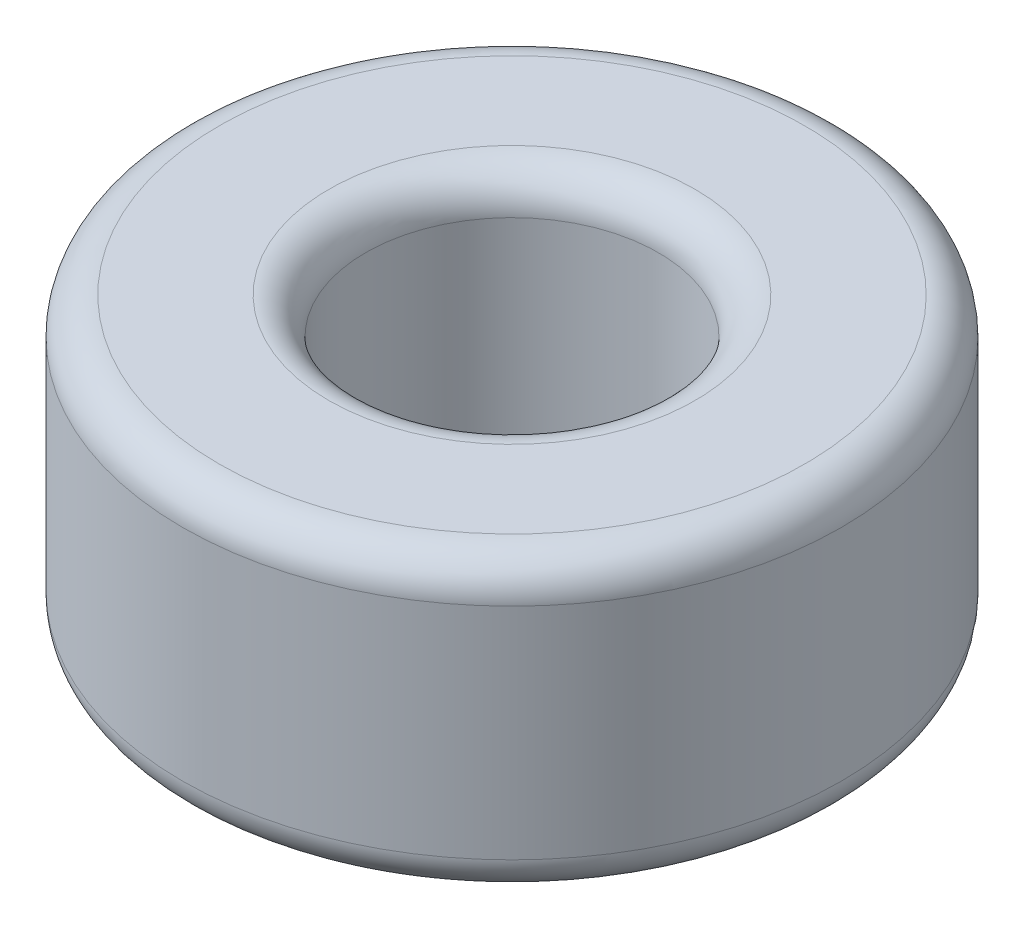
ISO-10303-21;
HEADER;
FILE_DESCRIPTION(('STEP AP214'),'2;1');
FILE_NAME('part.step','',(''),(''),'','','');
FILE_SCHEMA(('AUTOMOTIVE_DESIGN { 1 0 10303 214 1 1 1 1 }'));
ENDSEC;
DATA;
#1=APPLICATION_CONTEXT('core data for automotive mechanical design processes');
#2=APPLICATION_PROTOCOL_DEFINITION('international standard','automotive_design',2000,#1);
#3=PRODUCT_CONTEXT('',#1,'mechanical');
#4=PRODUCT('Part','Part','',(#3));
#5=PRODUCT_RELATED_PRODUCT_CATEGORY('part','',(#4));
#6=PRODUCT_DEFINITION_FORMATION('','',#4);
#7=PRODUCT_DEFINITION_CONTEXT('part definition',#1,'design');
#8=PRODUCT_DEFINITION('design','',#6,#7);
#9=PRODUCT_DEFINITION_SHAPE('','',#8);
#10=(LENGTH_UNIT() NAMED_UNIT(*) SI_UNIT(.MILLI.,.METRE.));
#11=(NAMED_UNIT(*) PLANE_ANGLE_UNIT() SI_UNIT($,.RADIAN.));
#12=(NAMED_UNIT(*) SI_UNIT($,.STERADIAN.) SOLID_ANGLE_UNIT());
#13=UNCERTAINTY_MEASURE_WITH_UNIT(LENGTH_MEASURE(1.E-05),#10,'distance_accuracy_value','');
#14=(GEOMETRIC_REPRESENTATION_CONTEXT(3) GLOBAL_UNCERTAINTY_ASSIGNED_CONTEXT((#13)) GLOBAL_UNIT_ASSIGNED_CONTEXT((#10,
#11,#12)) REPRESENTATION_CONTEXT('',''));
#15=CARTESIAN_POINT('',(0.,0.,0.));
#16=DIRECTION('',(0.,0.,1.));
#17=DIRECTION('',(1.,0.,0.));
#18=AXIS2_PLACEMENT_3D('',#15,#16,#17);
#19=CARTESIAN_POINT('',(0.,4.,0.));
#20=DIRECTION('',(0.,1.,0.));
#21=DIRECTION('',(0.,0.,1.));
#22=AXIS2_PLACEMENT_3D('',#19,#20,#21);
#23=PLANE('',#22);
#24=CARTESIAN_POINT('',(0.,4.,0.));
#25=DIRECTION('',(0.,1.,0.));
#26=DIRECTION('',(0.,0.,1.));
#27=AXIS2_PLACEMENT_3D('',#24,#25,#26);
#28=CIRCLE('',#27,2.5);
#29=CARTESIAN_POINT('',(0.,4.,2.5));
#30=VERTEX_POINT('',#29);
#31=EDGE_CURVE('E10',#30,#30,#28,.F.);
#32=ORIENTED_EDGE('',*,*,#31,.T.);
#33=EDGE_LOOP('',(#32));
#34=FACE_BOUND('',#33,.T.);
#35=CARTESIAN_POINT('',(0.,4.,0.));
#36=DIRECTION('',(0.,1.,0.));
#37=DIRECTION('',(0.,0.,1.));
#38=AXIS2_PLACEMENT_3D('',#35,#36,#37);
#39=CIRCLE('',#38,4.);
#40=CARTESIAN_POINT('',(0.,4.,4.));
#41=VERTEX_POINT('',#40);
#42=EDGE_CURVE('E41',#41,#41,#39,.T.);
#43=ORIENTED_EDGE('',*,*,#42,.T.);
#44=EDGE_LOOP('',(#43));
#45=FACE_BOUND('',#44,.T.);
#46=ADVANCED_FACE('F34',(#34,#45),#23,.T.);
#47=CARTESIAN_POINT('',(0.,0.,0.));
#48=DIRECTION('',(0.,1.,0.));
#49=DIRECTION('',(0.,0.,1.));
#50=AXIS2_PLACEMENT_3D('',#47,#48,#49);
#51=PLANE('',#50);
#52=CARTESIAN_POINT('',(0.,0.,0.));
#53=DIRECTION('',(0.,1.,0.));
#54=DIRECTION('',(0.,0.,1.));
#55=AXIS2_PLACEMENT_3D('',#52,#53,#54);
#56=CIRCLE('',#55,2.5);
#57=CARTESIAN_POINT('',(0.,0.,2.5));
#58=VERTEX_POINT('',#57);
#59=EDGE_CURVE('E60',#58,#58,#56,.T.);
#60=ORIENTED_EDGE('',*,*,#59,.T.);
#61=EDGE_LOOP('',(#60));
#62=FACE_BOUND('',#61,.T.);
#63=CARTESIAN_POINT('',(0.,0.,0.));
#64=DIRECTION('',(0.,1.,0.));
#65=DIRECTION('',(0.,0.,1.));
#66=AXIS2_PLACEMENT_3D('',#63,#64,#65);
#67=CIRCLE('',#66,4.);
#68=CARTESIAN_POINT('',(0.,0.,4.));
#69=VERTEX_POINT('',#68);
#70=EDGE_CURVE('E63',#69,#69,#67,.F.);
#71=ORIENTED_EDGE('',*,*,#70,.T.);
#72=EDGE_LOOP('',(#71));
#73=FACE_BOUND('',#72,.T.);
#74=ADVANCED_FACE('F67',(#62,#73),#51,.F.);
#75=CARTESIAN_POINT('',(0.,4.,0.));
#76=DIRECTION('',(0.,-1.,0.));
#77=DIRECTION('',(0.,0.,-1.));
#78=AXIS2_PLACEMENT_3D('',#75,#76,#77);
#79=CYLINDRICAL_SURFACE('',#78,4.5);
#80=CARTESIAN_POINT('',(0.,0.5,0.));
#81=DIRECTION('',(0.,1.,0.));
#82=DIRECTION('',(0.,0.,1.));
#83=AXIS2_PLACEMENT_3D('',#80,#81,#82);
#84=CIRCLE('',#83,4.5);
#85=CARTESIAN_POINT('',(0.,0.5,4.5));
#86=VERTEX_POINT('',#85);
#87=EDGE_CURVE('E45',#86,#86,#84,.T.);
#88=ORIENTED_EDGE('',*,*,#87,.T.);
#89=EDGE_LOOP('',(#88));
#90=FACE_BOUND('',#89,.T.);
#91=CARTESIAN_POINT('',(0.,3.5,0.));
#92=DIRECTION('',(0.,1.,0.));
#93=DIRECTION('',(0.,0.,1.));
#94=AXIS2_PLACEMENT_3D('',#91,#92,#93);
#95=CIRCLE('',#94,4.5);
#96=CARTESIAN_POINT('',(0.,3.5,4.5));
#97=VERTEX_POINT('',#96);
#98=EDGE_CURVE('E49',#97,#97,#95,.F.);
#99=ORIENTED_EDGE('',*,*,#98,.T.);
#100=EDGE_LOOP('',(#99));
#101=FACE_BOUND('',#100,.T.);
#102=ADVANCED_FACE('F77',(#90,#101),#79,.T.);
#103=CARTESIAN_POINT('',(0.,4.,0.));
#104=DIRECTION('',(0.,-1.,0.));
#105=DIRECTION('',(0.,0.,-1.));
#106=AXIS2_PLACEMENT_3D('',#103,#104,#105);
#107=CYLINDRICAL_SURFACE('',#106,2.);
#108=CARTESIAN_POINT('',(0.,0.5,0.));
#109=DIRECTION('',(0.,1.,0.));
#110=DIRECTION('',(0.,0.,1.));
#111=AXIS2_PLACEMENT_3D('',#108,#109,#110);
#112=CIRCLE('',#111,2.);
#113=CARTESIAN_POINT('',(0.,0.5,2.));
#114=VERTEX_POINT('',#113);
#115=EDGE_CURVE('E54',#114,#114,#112,.F.);
#116=ORIENTED_EDGE('',*,*,#115,.T.);
#117=EDGE_LOOP('',(#116));
#118=FACE_BOUND('',#117,.T.);
#119=CARTESIAN_POINT('',(0.,3.5,0.));
#120=DIRECTION('',(0.,1.,0.));
#121=DIRECTION('',(0.,0.,1.));
#122=AXIS2_PLACEMENT_3D('',#119,#120,#121);
#123=CIRCLE('',#122,2.);
#124=CARTESIAN_POINT('',(0.,3.5,2.));
#125=VERTEX_POINT('',#124);
#126=EDGE_CURVE('E57',#125,#125,#123,.T.);
#127=ORIENTED_EDGE('',*,*,#126,.T.);
#128=EDGE_LOOP('',(#127));
#129=FACE_BOUND('',#128,.T.);
#130=ADVANCED_FACE('F80',(#118,#129),#107,.F.);
#131=CARTESIAN_POINT('',(0.,0.5,0.));
#132=DIRECTION('',(0.,1.,0.));
#133=DIRECTION('',(0.,0.,1.));
#134=AXIS2_PLACEMENT_3D('',#131,#132,#133);
#135=TOROIDAL_SURFACE('',#134,2.5,0.5);
#136=ORIENTED_EDGE('',*,*,#115,.F.);
#137=EDGE_LOOP('',(#136));
#138=FACE_BOUND('',#137,.T.);
#139=ORIENTED_EDGE('',*,*,#59,.F.);
#140=EDGE_LOOP('',(#139));
#141=FACE_BOUND('',#140,.T.);
#142=ADVANCED_FACE('F73',(#138,#141),#135,.T.);
#143=CARTESIAN_POINT('',(0.,0.5,0.));
#144=DIRECTION('',(0.,1.,0.));
#145=DIRECTION('',(0.,0.,1.));
#146=AXIS2_PLACEMENT_3D('',#143,#144,#145);
#147=TOROIDAL_SURFACE('',#146,4.,0.5);
#148=ORIENTED_EDGE('',*,*,#70,.F.);
#149=EDGE_LOOP('',(#148));
#150=FACE_BOUND('',#149,.T.);
#151=ORIENTED_EDGE('',*,*,#87,.F.);
#152=EDGE_LOOP('',(#151));
#153=FACE_BOUND('',#152,.T.);
#154=ADVANCED_FACE('F69',(#150,#153),#147,.T.);
#155=CARTESIAN_POINT('',(0.,3.5,0.));
#156=DIRECTION('',(0.,1.,0.));
#157=DIRECTION('',(0.,0.,1.));
#158=AXIS2_PLACEMENT_3D('',#155,#156,#157);
#159=TOROIDAL_SURFACE('',#158,2.5,0.5);
#160=ORIENTED_EDGE('',*,*,#31,.F.);
#161=EDGE_LOOP('',(#160));
#162=FACE_BOUND('',#161,.T.);
#163=ORIENTED_EDGE('',*,*,#126,.F.);
#164=EDGE_LOOP('',(#163));
#165=FACE_BOUND('',#164,.T.);
#166=ADVANCED_FACE('F72',(#162,#165),#159,.T.);
#167=CARTESIAN_POINT('',(0.,3.5,0.));
#168=DIRECTION('',(0.,1.,0.));
#169=DIRECTION('',(0.,0.,1.));
#170=AXIS2_PLACEMENT_3D('',#167,#168,#169);
#171=TOROIDAL_SURFACE('',#170,4.,0.5);
#172=ORIENTED_EDGE('',*,*,#98,.F.);
#173=EDGE_LOOP('',(#172));
#174=FACE_BOUND('',#173,.T.);
#175=ORIENTED_EDGE('',*,*,#42,.F.);
#176=EDGE_LOOP('',(#175));
#177=FACE_BOUND('',#176,.T.);
#178=ADVANCED_FACE('F36',(#174,#177),#171,.T.);
#179=CLOSED_SHELL('',(#46,#74,#102,#130,#142,#154,#166,#178));
#180=MANIFOLD_SOLID_BREP('B2',#179);
#181=ADVANCED_BREP_SHAPE_REPRESENTATION('',(#18,#180),#14);
#182=SHAPE_DEFINITION_REPRESENTATION(#9,#181);
ENDSEC;
END-ISO-10303-21;
